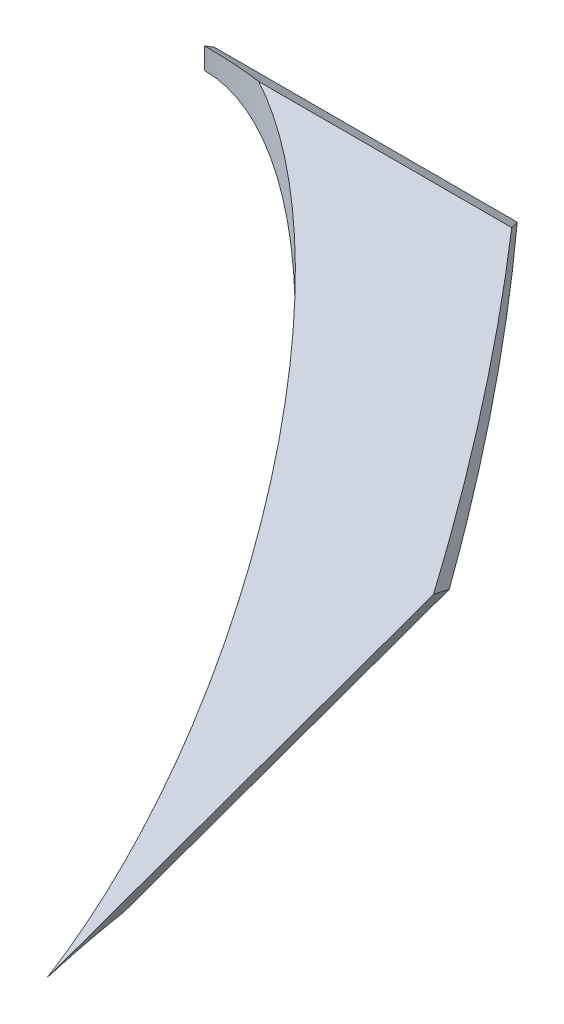
ISO-10303-21;
HEADER;
FILE_DESCRIPTION(('STEP AP214'),'2;1');
FILE_NAME('part.step','',(''),(''),'','','');
FILE_SCHEMA(('AUTOMOTIVE_DESIGN { 1 0 10303 214 1 1 1 1 }'));
ENDSEC;
DATA;
#1=APPLICATION_CONTEXT('core data for automotive mechanical design processes');
#2=APPLICATION_PROTOCOL_DEFINITION('international standard','automotive_design',2000,#1);
#3=PRODUCT_CONTEXT('',#1,'mechanical');
#4=PRODUCT('Part','Part','',(#3));
#5=PRODUCT_RELATED_PRODUCT_CATEGORY('part','',(#4));
#6=PRODUCT_DEFINITION_FORMATION('','',#4);
#7=PRODUCT_DEFINITION_CONTEXT('part definition',#1,'design');
#8=PRODUCT_DEFINITION('design','',#6,#7);
#9=PRODUCT_DEFINITION_SHAPE('','',#8);
#10=(LENGTH_UNIT() NAMED_UNIT(*) SI_UNIT(.MILLI.,.METRE.));
#11=(NAMED_UNIT(*) PLANE_ANGLE_UNIT() SI_UNIT($,.RADIAN.));
#12=(NAMED_UNIT(*) SI_UNIT($,.STERADIAN.) SOLID_ANGLE_UNIT());
#13=UNCERTAINTY_MEASURE_WITH_UNIT(LENGTH_MEASURE(1.E-05),#10,'distance_accuracy_value','');
#14=(GEOMETRIC_REPRESENTATION_CONTEXT(3) GLOBAL_UNCERTAINTY_ASSIGNED_CONTEXT((#13)) GLOBAL_UNIT_ASSIGNED_CONTEXT((#10,
#11,#12)) REPRESENTATION_CONTEXT('',''));
#15=CARTESIAN_POINT('',(0.,0.,0.));
#16=DIRECTION('',(0.,0.,1.));
#17=DIRECTION('',(1.,0.,0.));
#18=AXIS2_PLACEMENT_3D('',#15,#16,#17);
#19=CARTESIAN_POINT('',(0.,-0.0100000000000347,0.));
#20=DIRECTION('',(0.,1.,0.));
#21=DIRECTION('',(0.,0.,1.));
#22=AXIS2_PLACEMENT_3D('',#19,#20,#21);
#23=CYLINDRICAL_SURFACE('',#22,30.);
#24=CARTESIAN_POINT('',(0.,51.961524227067,0.));
#25=DIRECTION('',(0.866025403784442,-0.499999999999995,0.));
#26=DIRECTION('',(0.499999999999995,0.866025403784442,0.));
#27=AXIS2_PLACEMENT_3D('',#24,#25,#26);
#28=ELLIPSE('',#27,60.0000000000006,30.);
#29=CARTESIAN_POINT('',(28.4554180824982,101.247754096569,9.50206197360513));
#30=VERTEX_POINT('',#29);
#31=CARTESIAN_POINT('',(24.9818127790834,95.2312932256136,16.6105096330855));
#32=VERTEX_POINT('',#31);
#33=EDGE_CURVE('E91',#30,#32,#28,.T.);
#34=ORIENTED_EDGE('',*,*,#33,.T.);
#35=CARTESIAN_POINT('',(0.,122.915475947423,0.));
#36=DIRECTION('',(0.,-0.514495755427527,-0.857492925712544));
#37=DIRECTION('',(0.,-0.857492925712544,0.514495755427526));
#38=AXIS2_PLACEMENT_3D('',#35,#36,#37);
#39=ELLIPSE('',#38,58.309518948453,30.);
#40=CARTESIAN_POINT('',(8.69022160531151,170.771743633141,-28.7137606114312));
#41=VERTEX_POINT('',#40);
#42=EDGE_CURVE('E99',#41,#32,#39,.T.);
#43=ORIENTED_EDGE('',*,*,#42,.F.);
#44=CARTESIAN_POINT('',(0.,188.,0.));
#45=DIRECTION('',(0.,-0.857492925712544,0.514495755427527));
#46=DIRECTION('',(0.,-0.514495755427527,-0.857492925712544));
#47=AXIS2_PLACEMENT_3D('',#44,#45,#46);
#48=ELLIPSE('',#47,34.9857113690718,30.);
#49=CARTESIAN_POINT('',(0.,170.,-30.));
#50=VERTEX_POINT('',#49);
#51=EDGE_CURVE('E95',#50,#41,#48,.T.);
#52=ORIENTED_EDGE('',*,*,#51,.F.);
#53=DIRECTION('',(0.,-1.,0.));
#54=VECTOR('',#53,1.);
#55=CARTESIAN_POINT('',(0.,190.,-30.));
#56=LINE('',#55,#54);
#57=CARTESIAN_POINT('',(0.,167.084524052577,-30.));
#58=VERTEX_POINT('',#57);
#59=EDGE_CURVE('E93',#58,#50,#56,.F.);
#60=ORIENTED_EDGE('',*,*,#59,.F.);
#61=CARTESIAN_POINT('',(0.,117.084524052577,0.));
#62=DIRECTION('',(0.,-0.514495755427527,-0.857492925712544));
#63=DIRECTION('',(0.,-0.857492925712544,0.514495755427526));
#64=AXIS2_PLACEMENT_3D('',#61,#62,#63);
#65=ELLIPSE('',#64,58.309518948453,30.);
#66=EDGE_CURVE('E38',#58,#30,#65,.T.);
#67=ORIENTED_EDGE('',*,*,#66,.T.);
#68=EDGE_LOOP('',(#34,#43,#52,#60,#67));
#69=FACE_BOUND('',#68,.T.);
#70=ADVANCED_FACE('F34',(#69),#23,.F.);
#71=CARTESIAN_POINT('',(-30.,0.,-52.01));
#72=DIRECTION('',(0.866025403784442,-0.499999999999995,0.));
#73=DIRECTION('',(0.499999999999995,0.866025403784442,0.));
#74=AXIS2_PLACEMENT_3D('',#71,#72,#73);
#75=PLANE('',#74);
#76=ORIENTED_EDGE('',*,*,#33,.F.);
#77=DIRECTION('',(-0.443678254708052,-0.768473279367842,0.461083967620705));
#78=VECTOR('',#77,1.);
#79=CARTESIAN_POINT('',(-9.72309370116751,35.1206319298918,49.1783352736114));
#80=LINE('',#79,#78);
#81=CARTESIAN_POINT('',(50.297526913076,139.079396335579,-13.1969233698009));
#82=VERTEX_POINT('',#81);
#83=EDGE_CURVE('E87',#82,#30,#80,.T.);
#84=ORIENTED_EDGE('',*,*,#83,.F.);
#85=CARTESIAN_POINT('',(0.,51.961524227067,0.));
#86=DIRECTION('',(0.866025403784442,-0.499999999999995,0.));
#87=DIRECTION('',(0.499999999999995,0.866025403784442,0.));
#88=AXIS2_PLACEMENT_3D('',#85,#86,#87);
#89=ELLIPSE('',#88,104.000000000001,52.);
#90=CARTESIAN_POINT('',(50.9534611546419,140.215507768395,-10.3800190925835));
#91=VERTEX_POINT('',#90);
#92=EDGE_CURVE('E109',#82,#91,#89,.T.);
#93=ORIENTED_EDGE('',*,*,#92,.T.);
#94=DIRECTION('',(-0.443678254708052,-0.768473279367842,0.461083967620705));
#95=VECTOR('',#94,1.);
#96=CARTESIAN_POINT('',(-9.00738075277965,36.3602831201345,51.9331156963729));
#97=LINE('',#96,#95);
#98=EDGE_CURVE('E114',#91,#32,#97,.T.);
#99=ORIENTED_EDGE('',*,*,#98,.T.);
#100=EDGE_LOOP('',(#76,#84,#93,#99));
#101=FACE_BOUND('',#100,.T.);
#102=ADVANCED_FACE('F36',(#101),#75,.T.);
#103=CARTESIAN_POINT('',(0.,32.5364495154942,54.2274158591571));
#104=DIRECTION('',(0.,-0.514495755427527,-0.857492925712544));
#105=DIRECTION('',(0.,0.857492925712544,-0.514495755427526));
#106=AXIS2_PLACEMENT_3D('',#103,#104,#105);
#107=PLANE('',#106);
#108=CARTESIAN_POINT('',(0.,122.915475947423,0.));
#109=DIRECTION('',(0.,-0.514495755427527,-0.857492925712544));
#110=DIRECTION('',(0.,0.857492925712544,-0.514495755427526));
#111=AXIS2_PLACEMENT_3D('',#108,#109,#110);
#112=ELLIPSE('',#111,101.069832843985,52.);
#113=CARTESIAN_POINT('',(43.3534306779685,170.771743633141,-28.7137606114312));
#114=VERTEX_POINT('',#113);
#115=EDGE_CURVE('E43',#114,#91,#112,.T.);
#116=ORIENTED_EDGE('',*,*,#115,.F.);
#117=DIRECTION('',(-1.,0.,0.));
#118=VECTOR('',#117,1.);
#119=CARTESIAN_POINT('',(0.,170.771743633141,-28.7137606114312));
#120=LINE('',#119,#118);
#121=EDGE_CURVE('E51',#114,#41,#120,.T.);
#122=ORIENTED_EDGE('',*,*,#121,.T.);
#123=ORIENTED_EDGE('',*,*,#42,.T.);
#124=ORIENTED_EDGE('',*,*,#98,.F.);
#125=EDGE_LOOP('',(#116,#122,#123,#124));
#126=FACE_BOUND('',#125,.T.);
#127=ADVANCED_FACE('F120',(#126),#107,.F.);
#128=CARTESIAN_POINT('',(0.,170.771743633141,-28.7137606114312));
#129=DIRECTION('',(1.,0.,0.));
#130=DIRECTION('',(0.,0.,-1.));
#131=AXIS2_PLACEMENT_3D('',#128,#129,#130);
#132=PLANE('',#131);
#133=DIRECTION('',(0.,-0.857492925712544,0.514495755427526));
#134=VECTOR('',#133,1.);
#135=CARTESIAN_POINT('',(0.,169.228256366859,-31.2862393885688));
#136=LINE('',#135,#134);
#137=CARTESIAN_POINT('',(0.,169.228256366859,-31.2862393885688));
#138=VERTEX_POINT('',#137);
#139=EDGE_CURVE('E85',#138,#58,#136,.T.);
#140=ORIENTED_EDGE('',*,*,#139,.T.);
#141=ORIENTED_EDGE('',*,*,#59,.T.);
#142=DIRECTION('',(0.,-0.514495755427527,-0.857492925712544));
#143=VECTOR('',#142,1.);
#144=CARTESIAN_POINT('',(0.,170.771743633141,-28.7137606114312));
#145=LINE('',#144,#143);
#146=EDGE_CURVE('E102',#50,#138,#145,.T.);
#147=ORIENTED_EDGE('',*,*,#146,.T.);
#148=EDGE_LOOP('',(#140,#141,#147));
#149=FACE_BOUND('',#148,.T.);
#150=ADVANCED_FACE('F101',(#149),#132,.F.);
#151=CARTESIAN_POINT('',(0.,30.9929622492117,51.6549370820194));
#152=DIRECTION('',(0.,-0.514495755427527,-0.857492925712544));
#153=DIRECTION('',(0.,0.857492925712544,-0.514495755427526));
#154=AXIS2_PLACEMENT_3D('',#151,#152,#153);
#155=PLANE('',#154);
#156=DIRECTION('',(-1.,0.,0.));
#157=VECTOR('',#156,1.);
#158=CARTESIAN_POINT('',(0.,169.228256366859,-31.2862393885688));
#159=LINE('',#158,#157);
#160=CARTESIAN_POINT('',(41.5351805692616,169.228256366859,-31.2862393885688));
#161=VERTEX_POINT('',#160);
#162=EDGE_CURVE('E59',#161,#138,#159,.T.);
#163=ORIENTED_EDGE('',*,*,#162,.F.);
#164=CARTESIAN_POINT('',(0.,117.084524052577,0.));
#165=DIRECTION('',(0.,-0.514495755427527,-0.857492925712544));
#166=DIRECTION('',(0.,0.857492925712544,-0.514495755427526));
#167=AXIS2_PLACEMENT_3D('',#164,#165,#166);
#168=ELLIPSE('',#167,101.069832843985,52.);
#169=EDGE_CURVE('E104',#161,#82,#168,.T.);
#170=ORIENTED_EDGE('',*,*,#169,.T.);
#171=ORIENTED_EDGE('',*,*,#83,.T.);
#172=ORIENTED_EDGE('',*,*,#66,.F.);
#173=ORIENTED_EDGE('',*,*,#139,.F.);
#174=EDGE_LOOP('',(#163,#170,#171,#172,#173));
#175=FACE_BOUND('',#174,.T.);
#176=ADVANCED_FACE('F83',(#175),#155,.T.);
#177=CARTESIAN_POINT('',(0.,-0.01,0.));
#178=DIRECTION('',(0.,1.,0.));
#179=DIRECTION('',(0.,0.,1.));
#180=AXIS2_PLACEMENT_3D('',#177,#178,#179);
#181=CYLINDRICAL_SURFACE('',#180,52.);
#182=ORIENTED_EDGE('',*,*,#92,.F.);
#183=ORIENTED_EDGE('',*,*,#169,.F.);
#184=CARTESIAN_POINT('',(0.,188.,0.));
#185=DIRECTION('',(0.,-0.857492925712544,0.514495755427527));
#186=DIRECTION('',(0.,0.514495755427527,0.857492925712544));
#187=AXIS2_PLACEMENT_3D('',#184,#185,#186);
#188=ELLIPSE('',#187,60.6418997063911,52.);
#189=EDGE_CURVE('E11',#161,#114,#188,.T.);
#190=ORIENTED_EDGE('',*,*,#189,.T.);
#191=ORIENTED_EDGE('',*,*,#115,.T.);
#192=EDGE_LOOP('',(#182,#183,#190,#191));
#193=FACE_BOUND('',#192,.T.);
#194=ADVANCED_FACE('F123',(#193),#181,.T.);
#195=CARTESIAN_POINT('',(0.,170.771743633141,-28.7137606114312));
#196=DIRECTION('',(0.,-0.857492925712544,0.514495755427527));
#197=DIRECTION('',(0.,-0.514495755427527,-0.857492925712544));
#198=AXIS2_PLACEMENT_3D('',#195,#196,#197);
#199=PLANE('',#198);
#200=ORIENTED_EDGE('',*,*,#189,.F.);
#201=ORIENTED_EDGE('',*,*,#162,.T.);
#202=ORIENTED_EDGE('',*,*,#146,.F.);
#203=ORIENTED_EDGE('',*,*,#51,.T.);
#204=ORIENTED_EDGE('',*,*,#121,.F.);
#205=EDGE_LOOP('',(#200,#201,#202,#203,#204));
#206=FACE_BOUND('',#205,.T.);
#207=ADVANCED_FACE('F124',(#206),#199,.F.);
#208=CLOSED_SHELL('',(#70,#102,#127,#150,#176,#194,#207));
#209=MANIFOLD_SOLID_BREP('B2',#208);
#210=ADVANCED_BREP_SHAPE_REPRESENTATION('',(#18,#209),#14);
#211=SHAPE_DEFINITION_REPRESENTATION(#9,#210);
ENDSEC;
END-ISO-10303-21;
